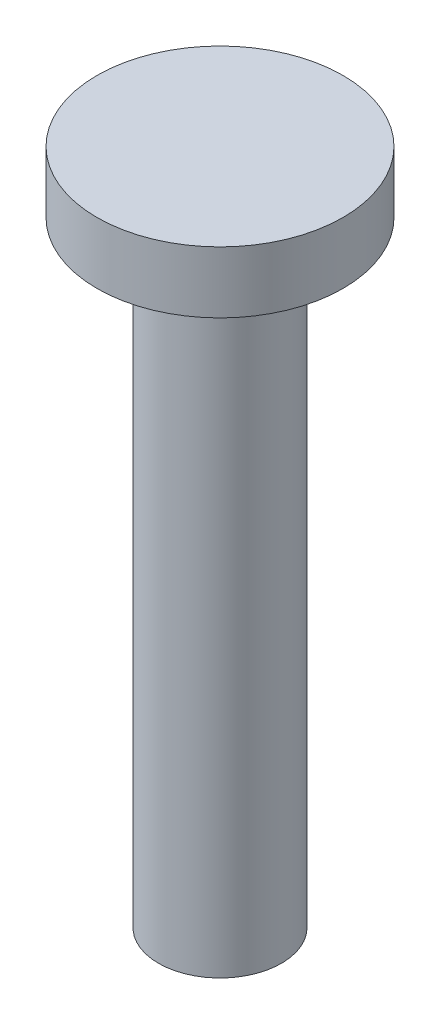
ISO-10303-21;
HEADER;
FILE_DESCRIPTION(('STEP AP214'),'2;1');
FILE_NAME('part.step','',(''),(''),'','','');
FILE_SCHEMA(('AUTOMOTIVE_DESIGN { 1 0 10303 214 1 1 1 1 }'));
ENDSEC;
DATA;
#1=APPLICATION_CONTEXT('core data for automotive mechanical design processes');
#2=APPLICATION_PROTOCOL_DEFINITION('international standard','automotive_design',2000,#1);
#3=PRODUCT_CONTEXT('',#1,'mechanical');
#4=PRODUCT('Part','Part','',(#3));
#5=PRODUCT_RELATED_PRODUCT_CATEGORY('part','',(#4));
#6=PRODUCT_DEFINITION_FORMATION('','',#4);
#7=PRODUCT_DEFINITION_CONTEXT('part definition',#1,'design');
#8=PRODUCT_DEFINITION('design','',#6,#7);
#9=PRODUCT_DEFINITION_SHAPE('','',#8);
#10=(LENGTH_UNIT() NAMED_UNIT(*) SI_UNIT(.MILLI.,.METRE.));
#11=(NAMED_UNIT(*) PLANE_ANGLE_UNIT() SI_UNIT($,.RADIAN.));
#12=(NAMED_UNIT(*) SI_UNIT($,.STERADIAN.) SOLID_ANGLE_UNIT());
#13=UNCERTAINTY_MEASURE_WITH_UNIT(LENGTH_MEASURE(1.E-05),#10,'distance_accuracy_value','');
#14=(GEOMETRIC_REPRESENTATION_CONTEXT(3) GLOBAL_UNCERTAINTY_ASSIGNED_CONTEXT((#13)) GLOBAL_UNIT_ASSIGNED_CONTEXT((#10,
#11,#12)) REPRESENTATION_CONTEXT('',''));
#15=CARTESIAN_POINT('',(0.,0.,0.));
#16=DIRECTION('',(0.,0.,1.));
#17=DIRECTION('',(1.,0.,0.));
#18=AXIS2_PLACEMENT_3D('',#15,#16,#17);
#19=CARTESIAN_POINT('',(0.,31.75,0.));
#20=DIRECTION('',(0.,-1.,0.));
#21=DIRECTION('',(0.,0.,-1.));
#22=AXIS2_PLACEMENT_3D('',#19,#20,#21);
#23=CYLINDRICAL_SURFACE('',#22,3.175);
#24=CARTESIAN_POINT('',(0.,31.75,0.));
#25=DIRECTION('',(0.,1.,0.));
#26=DIRECTION('',(0.,0.,1.));
#27=AXIS2_PLACEMENT_3D('',#24,#25,#26);
#28=CIRCLE('',#27,3.175);
#29=CARTESIAN_POINT('',(0.,31.75,3.175));
#30=VERTEX_POINT('',#29);
#31=EDGE_CURVE('E10',#30,#30,#28,.T.);
#32=ORIENTED_EDGE('',*,*,#31,.F.);
#33=EDGE_LOOP('',(#32));
#34=FACE_BOUND('',#33,.T.);
#35=CARTESIAN_POINT('',(0.,0.,0.));
#36=DIRECTION('',(0.,1.,0.));
#37=DIRECTION('',(0.,0.,1.));
#38=AXIS2_PLACEMENT_3D('',#35,#36,#37);
#39=CIRCLE('',#38,3.175);
#40=CARTESIAN_POINT('',(0.,0.,3.175));
#41=VERTEX_POINT('',#40);
#42=EDGE_CURVE('E46',#41,#41,#39,.T.);
#43=ORIENTED_EDGE('',*,*,#42,.T.);
#44=EDGE_LOOP('',(#43));
#45=FACE_BOUND('',#44,.T.);
#46=ADVANCED_FACE('F43',(#34,#45),#23,.T.);
#47=CARTESIAN_POINT('',(0.,0.,0.));
#48=DIRECTION('',(0.,1.,0.));
#49=DIRECTION('',(0.,0.,1.));
#50=AXIS2_PLACEMENT_3D('',#47,#48,#49);
#51=PLANE('',#50);
#52=ORIENTED_EDGE('',*,*,#42,.F.);
#53=EDGE_LOOP('',(#52));
#54=FACE_BOUND('',#53,.T.);
#55=ADVANCED_FACE('F70',(#54),#51,.F.);
#56=CARTESIAN_POINT('',(0.,34.925,0.));
#57=DIRECTION('',(0.,-1.,0.));
#58=DIRECTION('',(0.,0.,-1.));
#59=AXIS2_PLACEMENT_3D('',#56,#57,#58);
#60=CYLINDRICAL_SURFACE('',#59,6.35);
#61=CARTESIAN_POINT('',(0.,34.925,0.));
#62=DIRECTION('',(0.,1.,0.));
#63=DIRECTION('',(0.,0.,1.));
#64=AXIS2_PLACEMENT_3D('',#61,#62,#63);
#65=CIRCLE('',#64,6.35);
#66=CARTESIAN_POINT('',(0.,34.925,6.35));
#67=VERTEX_POINT('',#66);
#68=EDGE_CURVE('E55',#67,#67,#65,.T.);
#69=ORIENTED_EDGE('',*,*,#68,.F.);
#70=EDGE_LOOP('',(#69));
#71=FACE_BOUND('',#70,.T.);
#72=CARTESIAN_POINT('',(0.,31.75,0.));
#73=DIRECTION('',(0.,1.,0.));
#74=DIRECTION('',(0.,0.,1.));
#75=AXIS2_PLACEMENT_3D('',#72,#73,#74);
#76=CIRCLE('',#75,6.35);
#77=CARTESIAN_POINT('',(0.,31.75,6.35));
#78=VERTEX_POINT('',#77);
#79=EDGE_CURVE('E57',#78,#78,#76,.T.);
#80=ORIENTED_EDGE('',*,*,#79,.T.);
#81=EDGE_LOOP('',(#80));
#82=FACE_BOUND('',#81,.T.);
#83=ADVANCED_FACE('F67',(#71,#82),#60,.T.);
#84=CARTESIAN_POINT('',(0.,34.925,0.));
#85=DIRECTION('',(0.,1.,0.));
#86=DIRECTION('',(0.,0.,1.));
#87=AXIS2_PLACEMENT_3D('',#84,#85,#86);
#88=PLANE('',#87);
#89=ORIENTED_EDGE('',*,*,#68,.T.);
#90=EDGE_LOOP('',(#89));
#91=FACE_BOUND('',#90,.T.);
#92=ADVANCED_FACE('F65',(#91),#88,.T.);
#93=CARTESIAN_POINT('',(0.,31.75,0.));
#94=DIRECTION('',(0.,1.,0.));
#95=DIRECTION('',(0.,0.,1.));
#96=AXIS2_PLACEMENT_3D('',#93,#94,#95);
#97=PLANE('',#96);
#98=ORIENTED_EDGE('',*,*,#31,.T.);
#99=EDGE_LOOP('',(#98));
#100=FACE_BOUND('',#99,.T.);
#101=ORIENTED_EDGE('',*,*,#79,.F.);
#102=EDGE_LOOP('',(#101));
#103=FACE_BOUND('',#102,.T.);
#104=ADVANCED_FACE('F74',(#100,#103),#97,.F.);
#105=CLOSED_SHELL('',(#46,#55,#83,#92,#104));
#106=MANIFOLD_SOLID_BREP('B2',#105);
#107=ADVANCED_BREP_SHAPE_REPRESENTATION('',(#18,#106),#14);
#108=SHAPE_DEFINITION_REPRESENTATION(#9,#107);
ENDSEC;
END-ISO-10303-21;
